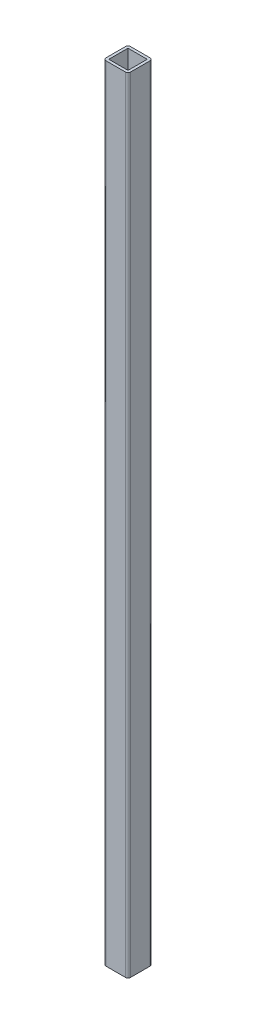
ISO-10303-21;
HEADER;
FILE_DESCRIPTION(('STEP AP214'),'2;1');
FILE_NAME('part.step','',(''),(''),'','','');
FILE_SCHEMA(('AUTOMOTIVE_DESIGN { 1 0 10303 214 1 1 1 1 }'));
ENDSEC;
DATA;
#1=APPLICATION_CONTEXT('core data for automotive mechanical design processes');
#2=APPLICATION_PROTOCOL_DEFINITION('international standard','automotive_design',2000,#1);
#3=PRODUCT_CONTEXT('',#1,'mechanical');
#4=PRODUCT('Part','Part','',(#3));
#5=PRODUCT_RELATED_PRODUCT_CATEGORY('part','',(#4));
#6=PRODUCT_DEFINITION_FORMATION('','',#4);
#7=PRODUCT_DEFINITION_CONTEXT('part definition',#1,'design');
#8=PRODUCT_DEFINITION('design','',#6,#7);
#9=PRODUCT_DEFINITION_SHAPE('','',#8);
#10=(LENGTH_UNIT() NAMED_UNIT(*) SI_UNIT(.MILLI.,.METRE.));
#11=(NAMED_UNIT(*) PLANE_ANGLE_UNIT() SI_UNIT($,.RADIAN.));
#12=(NAMED_UNIT(*) SI_UNIT($,.STERADIAN.) SOLID_ANGLE_UNIT());
#13=UNCERTAINTY_MEASURE_WITH_UNIT(LENGTH_MEASURE(1.E-05),#10,'distance_accuracy_value','');
#14=(GEOMETRIC_REPRESENTATION_CONTEXT(3) GLOBAL_UNCERTAINTY_ASSIGNED_CONTEXT((#13)) GLOBAL_UNIT_ASSIGNED_CONTEXT((#10,
#11,#12)) REPRESENTATION_CONTEXT('',''));
#15=CARTESIAN_POINT('',(0.,0.,0.));
#16=DIRECTION('',(0.,0.,1.));
#17=DIRECTION('',(1.,0.,0.));
#18=AXIS2_PLACEMENT_3D('',#15,#16,#17);
#19=CARTESIAN_POINT('',(22.8,816.,2.8));
#20=DIRECTION('',(0.,-1.,0.));
#21=DIRECTION('',(0.,0.,-1.));
#22=AXIS2_PLACEMENT_3D('',#19,#20,#21);
#23=CYLINDRICAL_SURFACE('',#22,2.8);
#24=CARTESIAN_POINT('',(22.8,0.,2.8));
#25=DIRECTION('',(0.,1.,0.));
#26=DIRECTION('',(0.,0.,-1.));
#27=AXIS2_PLACEMENT_3D('',#24,#25,#26);
#28=CIRCLE('',#27,2.8);
#29=CARTESIAN_POINT('',(25.6,0.,2.80000000000002));
#30=VERTEX_POINT('',#29);
#31=CARTESIAN_POINT('',(22.8,0.,0.));
#32=VERTEX_POINT('',#31);
#33=EDGE_CURVE('E155',#30,#32,#28,.T.);
#34=ORIENTED_EDGE('',*,*,#33,.T.);
#35=DIRECTION('',(0.,-1.,0.));
#36=VECTOR('',#35,1.);
#37=CARTESIAN_POINT('',(22.8,816.,0.));
#38=LINE('',#37,#36);
#39=CARTESIAN_POINT('',(22.8,816.,0.));
#40=VERTEX_POINT('',#39);
#41=EDGE_CURVE('E11',#40,#32,#38,.T.);
#42=ORIENTED_EDGE('',*,*,#41,.F.);
#43=CARTESIAN_POINT('',(22.8,816.,2.8));
#44=DIRECTION('',(0.,1.,0.));
#45=DIRECTION('',(0.,0.,-1.));
#46=AXIS2_PLACEMENT_3D('',#43,#44,#45);
#47=CIRCLE('',#46,2.8);
#48=CARTESIAN_POINT('',(25.6,816.,2.80000000000002));
#49=VERTEX_POINT('',#48);
#50=EDGE_CURVE('E159',#49,#40,#47,.T.);
#51=ORIENTED_EDGE('',*,*,#50,.F.);
#52=DIRECTION('',(0.,-1.,0.));
#53=VECTOR('',#52,1.);
#54=CARTESIAN_POINT('',(25.6,816.,2.80000000000002));
#55=LINE('',#54,#53);
#56=EDGE_CURVE('E177',#49,#30,#55,.T.);
#57=ORIENTED_EDGE('',*,*,#56,.T.);
#58=EDGE_LOOP('',(#34,#42,#51,#57));
#59=FACE_BOUND('',#58,.T.);
#60=ADVANCED_FACE('F34',(#59),#23,.T.);
#61=CARTESIAN_POINT('',(2.80000000000002,816.,0.));
#62=DIRECTION('',(0.,0.,1.));
#63=DIRECTION('',(1.,0.,0.));
#64=AXIS2_PLACEMENT_3D('',#61,#62,#63);
#65=PLANE('',#64);
#66=DIRECTION('',(-1.,0.,0.));
#67=VECTOR('',#66,1.);
#68=CARTESIAN_POINT('',(2.80000000000002,0.,0.));
#69=LINE('',#68,#67);
#70=CARTESIAN_POINT('',(2.80000000000002,0.,0.));
#71=VERTEX_POINT('',#70);
#72=EDGE_CURVE('E180',#32,#71,#69,.T.);
#73=ORIENTED_EDGE('',*,*,#72,.T.);
#74=DIRECTION('',(0.,-1.,0.));
#75=VECTOR('',#74,1.);
#76=CARTESIAN_POINT('',(2.80000000000002,816.,0.));
#77=LINE('',#76,#75);
#78=CARTESIAN_POINT('',(2.80000000000002,816.,0.));
#79=VERTEX_POINT('',#78);
#80=EDGE_CURVE('E41',#79,#71,#77,.T.);
#81=ORIENTED_EDGE('',*,*,#80,.F.);
#82=DIRECTION('',(-1.,0.,0.));
#83=VECTOR('',#82,1.);
#84=CARTESIAN_POINT('',(2.80000000000002,816.,0.));
#85=LINE('',#84,#83);
#86=EDGE_CURVE('E162',#40,#79,#85,.T.);
#87=ORIENTED_EDGE('',*,*,#86,.F.);
#88=ORIENTED_EDGE('',*,*,#41,.T.);
#89=EDGE_LOOP('',(#73,#81,#87,#88));
#90=FACE_BOUND('',#89,.T.);
#91=ADVANCED_FACE('F235',(#90),#65,.F.);
#92=CARTESIAN_POINT('',(2.8,816.,2.8));
#93=DIRECTION('',(0.,-1.,0.));
#94=DIRECTION('',(0.,0.,-1.));
#95=AXIS2_PLACEMENT_3D('',#92,#93,#94);
#96=CYLINDRICAL_SURFACE('',#95,2.8);
#97=CARTESIAN_POINT('',(2.8,0.,2.8));
#98=DIRECTION('',(0.,1.,0.));
#99=DIRECTION('',(0.,0.,1.));
#100=AXIS2_PLACEMENT_3D('',#97,#98,#99);
#101=CIRCLE('',#100,2.8);
#102=CARTESIAN_POINT('',(0.,0.,2.80000000000002));
#103=VERTEX_POINT('',#102);
#104=EDGE_CURVE('E182',#71,#103,#101,.T.);
#105=ORIENTED_EDGE('',*,*,#104,.T.);
#106=DIRECTION('',(0.,-1.,0.));
#107=VECTOR('',#106,1.);
#108=CARTESIAN_POINT('',(0.,816.,2.80000000000002));
#109=LINE('',#108,#107);
#110=CARTESIAN_POINT('',(0.,816.,2.80000000000002));
#111=VERTEX_POINT('',#110);
#112=EDGE_CURVE('E207',#111,#103,#109,.T.);
#113=ORIENTED_EDGE('',*,*,#112,.F.);
#114=CARTESIAN_POINT('',(2.8,816.,2.8));
#115=DIRECTION('',(0.,1.,0.));
#116=DIRECTION('',(0.,0.,1.));
#117=AXIS2_PLACEMENT_3D('',#114,#115,#116);
#118=CIRCLE('',#117,2.8);
#119=EDGE_CURVE('E165',#79,#111,#118,.T.);
#120=ORIENTED_EDGE('',*,*,#119,.F.);
#121=ORIENTED_EDGE('',*,*,#80,.T.);
#122=EDGE_LOOP('',(#105,#113,#120,#121));
#123=FACE_BOUND('',#122,.T.);
#124=ADVANCED_FACE('F214',(#123),#96,.T.);
#125=CARTESIAN_POINT('',(0.,816.,2.80000000000002));
#126=DIRECTION('',(1.,0.,0.));
#127=DIRECTION('',(0.,0.,-1.));
#128=AXIS2_PLACEMENT_3D('',#125,#126,#127);
#129=PLANE('',#128);
#130=DIRECTION('',(0.,0.,1.));
#131=VECTOR('',#130,1.);
#132=CARTESIAN_POINT('',(0.,0.,2.80000000000002));
#133=LINE('',#132,#131);
#134=CARTESIAN_POINT('',(0.,0.,22.8));
#135=VERTEX_POINT('',#134);
#136=EDGE_CURVE('E184',#103,#135,#133,.T.);
#137=ORIENTED_EDGE('',*,*,#136,.T.);
#138=DIRECTION('',(0.,-1.,0.));
#139=VECTOR('',#138,1.);
#140=CARTESIAN_POINT('',(0.,816.,22.8));
#141=LINE('',#140,#139);
#142=CARTESIAN_POINT('',(0.,816.,22.8));
#143=VERTEX_POINT('',#142);
#144=EDGE_CURVE('E204',#143,#135,#141,.T.);
#145=ORIENTED_EDGE('',*,*,#144,.F.);
#146=DIRECTION('',(0.,0.,1.));
#147=VECTOR('',#146,1.);
#148=CARTESIAN_POINT('',(0.,816.,2.80000000000002));
#149=LINE('',#148,#147);
#150=EDGE_CURVE('E167',#111,#143,#149,.T.);
#151=ORIENTED_EDGE('',*,*,#150,.F.);
#152=ORIENTED_EDGE('',*,*,#112,.T.);
#153=EDGE_LOOP('',(#137,#145,#151,#152));
#154=FACE_BOUND('',#153,.T.);
#155=ADVANCED_FACE('F225',(#154),#129,.F.);
#156=CARTESIAN_POINT('',(2.8,816.,22.8));
#157=DIRECTION('',(0.,-1.,0.));
#158=DIRECTION('',(0.,0.,-1.));
#159=AXIS2_PLACEMENT_3D('',#156,#157,#158);
#160=CYLINDRICAL_SURFACE('',#159,2.8);
#161=CARTESIAN_POINT('',(2.8,0.,22.8));
#162=DIRECTION('',(0.,1.,0.));
#163=DIRECTION('',(0.,0.,1.));
#164=AXIS2_PLACEMENT_3D('',#161,#162,#163);
#165=CIRCLE('',#164,2.8);
#166=CARTESIAN_POINT('',(2.80000000000002,0.,25.6));
#167=VERTEX_POINT('',#166);
#168=EDGE_CURVE('E186',#135,#167,#165,.T.);
#169=ORIENTED_EDGE('',*,*,#168,.T.);
#170=DIRECTION('',(0.,-1.,0.));
#171=VECTOR('',#170,1.);
#172=CARTESIAN_POINT('',(2.80000000000002,816.,25.6));
#173=LINE('',#172,#171);
#174=CARTESIAN_POINT('',(2.80000000000002,816.,25.6));
#175=VERTEX_POINT('',#174);
#176=EDGE_CURVE('E201',#175,#167,#173,.T.);
#177=ORIENTED_EDGE('',*,*,#176,.F.);
#178=CARTESIAN_POINT('',(2.8,816.,22.8));
#179=DIRECTION('',(0.,1.,0.));
#180=DIRECTION('',(0.,0.,1.));
#181=AXIS2_PLACEMENT_3D('',#178,#179,#180);
#182=CIRCLE('',#181,2.8);
#183=EDGE_CURVE('E169',#143,#175,#182,.T.);
#184=ORIENTED_EDGE('',*,*,#183,.F.);
#185=ORIENTED_EDGE('',*,*,#144,.T.);
#186=EDGE_LOOP('',(#169,#177,#184,#185));
#187=FACE_BOUND('',#186,.T.);
#188=ADVANCED_FACE('F229',(#187),#160,.T.);
#189=CARTESIAN_POINT('',(2.80000000000002,816.,25.6));
#190=DIRECTION('',(0.,0.,-1.));
#191=DIRECTION('',(-1.,0.,0.));
#192=AXIS2_PLACEMENT_3D('',#189,#190,#191);
#193=PLANE('',#192);
#194=DIRECTION('',(1.,0.,0.));
#195=VECTOR('',#194,1.);
#196=CARTESIAN_POINT('',(2.80000000000002,0.,25.6));
#197=LINE('',#196,#195);
#198=CARTESIAN_POINT('',(22.8,0.,25.6));
#199=VERTEX_POINT('',#198);
#200=EDGE_CURVE('E188',#167,#199,#197,.T.);
#201=ORIENTED_EDGE('',*,*,#200,.T.);
#202=DIRECTION('',(0.,-1.,0.));
#203=VECTOR('',#202,1.);
#204=CARTESIAN_POINT('',(22.8,816.,25.6));
#205=LINE('',#204,#203);
#206=CARTESIAN_POINT('',(22.8,816.,25.6));
#207=VERTEX_POINT('',#206);
#208=EDGE_CURVE('E198',#207,#199,#205,.T.);
#209=ORIENTED_EDGE('',*,*,#208,.F.);
#210=DIRECTION('',(1.,0.,0.));
#211=VECTOR('',#210,1.);
#212=CARTESIAN_POINT('',(2.80000000000002,816.,25.6));
#213=LINE('',#212,#211);
#214=EDGE_CURVE('E171',#175,#207,#213,.T.);
#215=ORIENTED_EDGE('',*,*,#214,.F.);
#216=ORIENTED_EDGE('',*,*,#176,.T.);
#217=EDGE_LOOP('',(#201,#209,#215,#216));
#218=FACE_BOUND('',#217,.T.);
#219=ADVANCED_FACE('F248',(#218),#193,.F.);
#220=CARTESIAN_POINT('',(22.8,816.,22.8));
#221=DIRECTION('',(0.,-1.,0.));
#222=DIRECTION('',(0.,0.,-1.));
#223=AXIS2_PLACEMENT_3D('',#220,#221,#222);
#224=CYLINDRICAL_SURFACE('',#223,2.8);
#225=CARTESIAN_POINT('',(22.8,0.,22.8));
#226=DIRECTION('',(0.,1.,0.));
#227=DIRECTION('',(0.,0.,1.));
#228=AXIS2_PLACEMENT_3D('',#225,#226,#227);
#229=CIRCLE('',#228,2.8);
#230=CARTESIAN_POINT('',(25.6,0.,22.8));
#231=VERTEX_POINT('',#230);
#232=EDGE_CURVE('E190',#199,#231,#229,.T.);
#233=ORIENTED_EDGE('',*,*,#232,.T.);
#234=DIRECTION('',(0.,-1.,0.));
#235=VECTOR('',#234,1.);
#236=CARTESIAN_POINT('',(25.6,816.,22.8));
#237=LINE('',#236,#235);
#238=CARTESIAN_POINT('',(25.6,816.,22.8));
#239=VERTEX_POINT('',#238);
#240=EDGE_CURVE('E195',#239,#231,#237,.T.);
#241=ORIENTED_EDGE('',*,*,#240,.F.);
#242=CARTESIAN_POINT('',(22.8,816.,22.8));
#243=DIRECTION('',(0.,1.,0.));
#244=DIRECTION('',(0.,0.,1.));
#245=AXIS2_PLACEMENT_3D('',#242,#243,#244);
#246=CIRCLE('',#245,2.8);
#247=EDGE_CURVE('E173',#207,#239,#246,.T.);
#248=ORIENTED_EDGE('',*,*,#247,.F.);
#249=ORIENTED_EDGE('',*,*,#208,.T.);
#250=EDGE_LOOP('',(#233,#241,#248,#249));
#251=FACE_BOUND('',#250,.T.);
#252=ADVANCED_FACE('F246',(#251),#224,.T.);
#253=CARTESIAN_POINT('',(25.6,816.,2.80000000000002));
#254=DIRECTION('',(-1.,0.,0.));
#255=DIRECTION('',(0.,0.,1.));
#256=AXIS2_PLACEMENT_3D('',#253,#254,#255);
#257=PLANE('',#256);
#258=DIRECTION('',(0.,0.,-1.));
#259=VECTOR('',#258,1.);
#260=CARTESIAN_POINT('',(25.6,0.,2.80000000000002));
#261=LINE('',#260,#259);
#262=EDGE_CURVE('E163',#231,#30,#261,.T.);
#263=ORIENTED_EDGE('',*,*,#262,.T.);
#264=ORIENTED_EDGE('',*,*,#56,.F.);
#265=DIRECTION('',(0.,0.,-1.));
#266=VECTOR('',#265,1.);
#267=CARTESIAN_POINT('',(25.6,816.,2.80000000000002));
#268=LINE('',#267,#266);
#269=EDGE_CURVE('E175',#239,#49,#268,.T.);
#270=ORIENTED_EDGE('',*,*,#269,.F.);
#271=ORIENTED_EDGE('',*,*,#240,.T.);
#272=EDGE_LOOP('',(#263,#264,#270,#271));
#273=FACE_BOUND('',#272,.T.);
#274=ADVANCED_FACE('F241',(#273),#257,.F.);
#275=CARTESIAN_POINT('',(22.8,816.,2.8));
#276=DIRECTION('',(0.,-1.,0.));
#277=DIRECTION('',(0.,0.,-1.));
#278=AXIS2_PLACEMENT_3D('',#275,#276,#277);
#279=PLANE('',#278);
#280=DIRECTION('',(1.,0.,0.));
#281=VECTOR('',#280,1.);
#282=CARTESIAN_POINT('',(2.8,816.,2.8));
#283=LINE('',#282,#281);
#284=CARTESIAN_POINT('',(2.8,816.,2.8));
#285=VERTEX_POINT('',#284);
#286=CARTESIAN_POINT('',(22.8,816.,2.8));
#287=VERTEX_POINT('',#286);
#288=EDGE_CURVE('E130',#285,#287,#283,.T.);
#289=ORIENTED_EDGE('',*,*,#288,.T.);
#290=DIRECTION('',(0.,0.,1.));
#291=VECTOR('',#290,1.);
#292=CARTESIAN_POINT('',(22.8,816.,2.8));
#293=LINE('',#292,#291);
#294=CARTESIAN_POINT('',(22.8,816.,22.8));
#295=VERTEX_POINT('',#294);
#296=EDGE_CURVE('E124',#287,#295,#293,.T.);
#297=ORIENTED_EDGE('',*,*,#296,.T.);
#298=DIRECTION('',(-1.,0.,0.));
#299=VECTOR('',#298,1.);
#300=CARTESIAN_POINT('',(2.8,816.,22.8));
#301=LINE('',#300,#299);
#302=CARTESIAN_POINT('',(2.8,816.,22.8));
#303=VERTEX_POINT('',#302);
#304=EDGE_CURVE('E133',#295,#303,#301,.T.);
#305=ORIENTED_EDGE('',*,*,#304,.T.);
#306=DIRECTION('',(0.,0.,-1.));
#307=VECTOR('',#306,1.);
#308=CARTESIAN_POINT('',(2.8,816.,2.8));
#309=LINE('',#308,#307);
#310=EDGE_CURVE('E48',#303,#285,#309,.T.);
#311=ORIENTED_EDGE('',*,*,#310,.T.);
#312=EDGE_LOOP('',(#289,#297,#305,#311));
#313=FACE_BOUND('',#312,.T.);
#314=ORIENTED_EDGE('',*,*,#50,.T.);
#315=ORIENTED_EDGE('',*,*,#86,.T.);
#316=ORIENTED_EDGE('',*,*,#119,.T.);
#317=ORIENTED_EDGE('',*,*,#150,.T.);
#318=ORIENTED_EDGE('',*,*,#183,.T.);
#319=ORIENTED_EDGE('',*,*,#214,.T.);
#320=ORIENTED_EDGE('',*,*,#247,.T.);
#321=ORIENTED_EDGE('',*,*,#269,.T.);
#322=EDGE_LOOP('',(#314,#315,#316,#317,#318,#319,#320,#321));
#323=FACE_BOUND('',#322,.T.);
#324=ADVANCED_FACE('F137',(#313,#323),#279,.F.);
#325=CARTESIAN_POINT('',(22.8,0.,2.8));
#326=DIRECTION('',(0.,-1.,0.));
#327=DIRECTION('',(0.,0.,-1.));
#328=AXIS2_PLACEMENT_3D('',#325,#326,#327);
#329=PLANE('',#328);
#330=DIRECTION('',(0.,0.,1.));
#331=VECTOR('',#330,1.);
#332=CARTESIAN_POINT('',(22.8,0.,2.8));
#333=LINE('',#332,#331);
#334=CARTESIAN_POINT('',(22.8,0.,2.8));
#335=VERTEX_POINT('',#334);
#336=CARTESIAN_POINT('',(22.8,0.,22.8));
#337=VERTEX_POINT('',#336);
#338=EDGE_CURVE('E56',#335,#337,#333,.T.);
#339=ORIENTED_EDGE('',*,*,#338,.F.);
#340=DIRECTION('',(1.,0.,0.));
#341=VECTOR('',#340,1.);
#342=CARTESIAN_POINT('',(2.8,0.,2.8));
#343=LINE('',#342,#341);
#344=CARTESIAN_POINT('',(2.8,0.,2.8));
#345=VERTEX_POINT('',#344);
#346=EDGE_CURVE('E140',#345,#335,#343,.T.);
#347=ORIENTED_EDGE('',*,*,#346,.F.);
#348=DIRECTION('',(0.,0.,-1.));
#349=VECTOR('',#348,1.);
#350=CARTESIAN_POINT('',(2.8,0.,2.8));
#351=LINE('',#350,#349);
#352=CARTESIAN_POINT('',(2.8,0.,22.8));
#353=VERTEX_POINT('',#352);
#354=EDGE_CURVE('E143',#353,#345,#351,.T.);
#355=ORIENTED_EDGE('',*,*,#354,.F.);
#356=DIRECTION('',(-1.,0.,0.));
#357=VECTOR('',#356,1.);
#358=CARTESIAN_POINT('',(2.8,0.,22.8));
#359=LINE('',#358,#357);
#360=EDGE_CURVE('E149',#337,#353,#359,.T.);
#361=ORIENTED_EDGE('',*,*,#360,.F.);
#362=EDGE_LOOP('',(#339,#347,#355,#361));
#363=FACE_BOUND('',#362,.T.);
#364=ORIENTED_EDGE('',*,*,#33,.F.);
#365=ORIENTED_EDGE('',*,*,#262,.F.);
#366=ORIENTED_EDGE('',*,*,#232,.F.);
#367=ORIENTED_EDGE('',*,*,#200,.F.);
#368=ORIENTED_EDGE('',*,*,#168,.F.);
#369=ORIENTED_EDGE('',*,*,#136,.F.);
#370=ORIENTED_EDGE('',*,*,#104,.F.);
#371=ORIENTED_EDGE('',*,*,#72,.F.);
#372=EDGE_LOOP('',(#364,#365,#366,#367,#368,#369,#370,#371));
#373=FACE_BOUND('',#372,.T.);
#374=ADVANCED_FACE('F220',(#363,#373),#329,.T.);
#375=CARTESIAN_POINT('',(22.8,816.,2.8));
#376=DIRECTION('',(1.,0.,0.));
#377=DIRECTION('',(0.,0.,-1.));
#378=AXIS2_PLACEMENT_3D('',#375,#376,#377);
#379=PLANE('',#378);
#380=ORIENTED_EDGE('',*,*,#338,.T.);
#381=DIRECTION('',(0.,-1.,0.));
#382=VECTOR('',#381,1.);
#383=CARTESIAN_POINT('',(22.8,816.,22.8));
#384=LINE('',#383,#382);
#385=EDGE_CURVE('E120',#295,#337,#384,.T.);
#386=ORIENTED_EDGE('',*,*,#385,.F.);
#387=ORIENTED_EDGE('',*,*,#296,.F.);
#388=DIRECTION('',(0.,-1.,0.));
#389=VECTOR('',#388,1.);
#390=CARTESIAN_POINT('',(22.8,816.,2.8));
#391=LINE('',#390,#389);
#392=EDGE_CURVE('E153',#287,#335,#391,.T.);
#393=ORIENTED_EDGE('',*,*,#392,.T.);
#394=EDGE_LOOP('',(#380,#386,#387,#393));
#395=FACE_BOUND('',#394,.T.);
#396=ADVANCED_FACE('F122',(#395),#379,.F.);
#397=CARTESIAN_POINT('',(2.8,816.,2.8));
#398=DIRECTION('',(0.,0.,-1.));
#399=DIRECTION('',(-1.,0.,0.));
#400=AXIS2_PLACEMENT_3D('',#397,#398,#399);
#401=PLANE('',#400);
#402=ORIENTED_EDGE('',*,*,#346,.T.);
#403=ORIENTED_EDGE('',*,*,#392,.F.);
#404=ORIENTED_EDGE('',*,*,#288,.F.);
#405=DIRECTION('',(0.,-1.,0.));
#406=VECTOR('',#405,1.);
#407=CARTESIAN_POINT('',(2.8,816.,2.8));
#408=LINE('',#407,#406);
#409=EDGE_CURVE('E156',#285,#345,#408,.T.);
#410=ORIENTED_EDGE('',*,*,#409,.T.);
#411=EDGE_LOOP('',(#402,#403,#404,#410));
#412=FACE_BOUND('',#411,.T.);
#413=ADVANCED_FACE('F319',(#412),#401,.F.);
#414=CARTESIAN_POINT('',(2.8,816.,2.8));
#415=DIRECTION('',(-1.,0.,0.));
#416=DIRECTION('',(0.,0.,1.));
#417=AXIS2_PLACEMENT_3D('',#414,#415,#416);
#418=PLANE('',#417);
#419=ORIENTED_EDGE('',*,*,#354,.T.);
#420=ORIENTED_EDGE('',*,*,#409,.F.);
#421=ORIENTED_EDGE('',*,*,#310,.F.);
#422=DIRECTION('',(0.,-1.,0.));
#423=VECTOR('',#422,1.);
#424=CARTESIAN_POINT('',(2.8,816.,22.8));
#425=LINE('',#424,#423);
#426=EDGE_CURVE('E129',#303,#353,#425,.T.);
#427=ORIENTED_EDGE('',*,*,#426,.T.);
#428=EDGE_LOOP('',(#419,#420,#421,#427));
#429=FACE_BOUND('',#428,.T.);
#430=ADVANCED_FACE('F328',(#429),#418,.F.);
#431=CARTESIAN_POINT('',(2.8,816.,22.8));
#432=DIRECTION('',(0.,0.,1.));
#433=DIRECTION('',(1.,0.,0.));
#434=AXIS2_PLACEMENT_3D('',#431,#432,#433);
#435=PLANE('',#434);
#436=ORIENTED_EDGE('',*,*,#360,.T.);
#437=ORIENTED_EDGE('',*,*,#426,.F.);
#438=ORIENTED_EDGE('',*,*,#304,.F.);
#439=ORIENTED_EDGE('',*,*,#385,.T.);
#440=EDGE_LOOP('',(#436,#437,#438,#439));
#441=FACE_BOUND('',#440,.T.);
#442=ADVANCED_FACE('F134',(#441),#435,.F.);
#443=CLOSED_SHELL('',(#60,#91,#124,#155,#188,#219,#252,#274,#324,#374,#396,#413,#430,#442));
#444=MANIFOLD_SOLID_BREP('B2',#443);
#445=ADVANCED_BREP_SHAPE_REPRESENTATION('',(#18,#444),#14);
#446=SHAPE_DEFINITION_REPRESENTATION(#9,#445);
ENDSEC;
END-ISO-10303-21;
